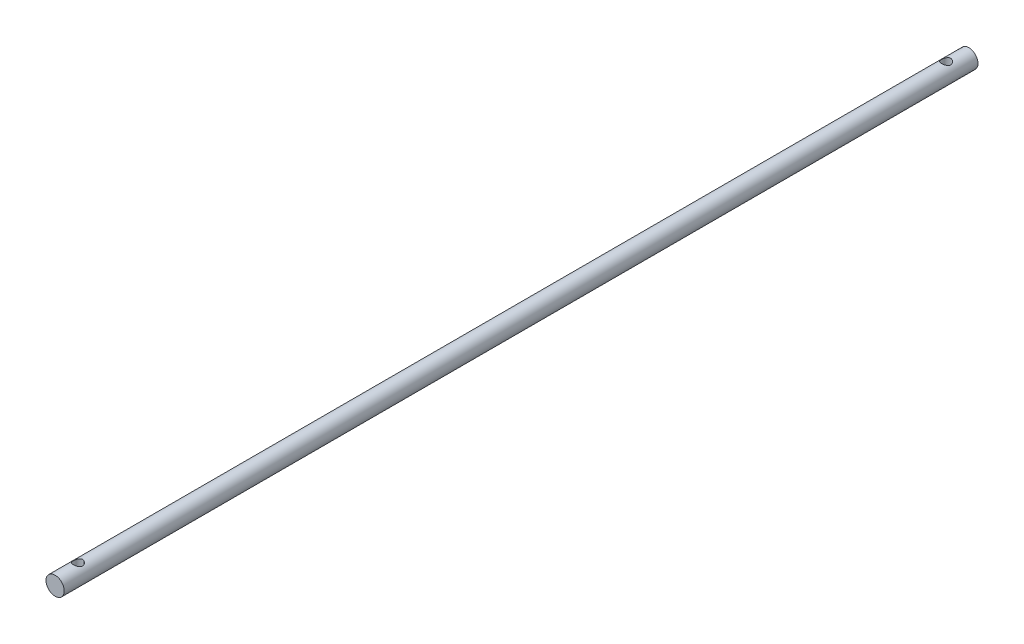
ISO-10303-21;
HEADER;
FILE_DESCRIPTION(('STEP AP214'),'2;1');
FILE_NAME('part.step','',(''),(''),'','','');
FILE_SCHEMA(('AUTOMOTIVE_DESIGN { 1 0 10303 214 1 1 1 1 }'));
ENDSEC;
DATA;
#1=APPLICATION_CONTEXT('core data for automotive mechanical design processes');
#2=APPLICATION_PROTOCOL_DEFINITION('international standard','automotive_design',2000,#1);
#3=PRODUCT_CONTEXT('',#1,'mechanical');
#4=PRODUCT('Part','Part','',(#3));
#5=PRODUCT_RELATED_PRODUCT_CATEGORY('part','',(#4));
#6=PRODUCT_DEFINITION_FORMATION('','',#4);
#7=PRODUCT_DEFINITION_CONTEXT('part definition',#1,'design');
#8=PRODUCT_DEFINITION('design','',#6,#7);
#9=PRODUCT_DEFINITION_SHAPE('','',#8);
#10=(LENGTH_UNIT() NAMED_UNIT(*) SI_UNIT(.MILLI.,.METRE.));
#11=(NAMED_UNIT(*) PLANE_ANGLE_UNIT() SI_UNIT($,.RADIAN.));
#12=(NAMED_UNIT(*) SI_UNIT($,.STERADIAN.) SOLID_ANGLE_UNIT());
#13=UNCERTAINTY_MEASURE_WITH_UNIT(LENGTH_MEASURE(1.E-05),#10,'distance_accuracy_value','');
#14=(GEOMETRIC_REPRESENTATION_CONTEXT(3) GLOBAL_UNCERTAINTY_ASSIGNED_CONTEXT((#13)) GLOBAL_UNIT_ASSIGNED_CONTEXT((#10,
#11,#12)) REPRESENTATION_CONTEXT('',''));
#15=CARTESIAN_POINT('',(0.,0.,0.));
#16=DIRECTION('',(0.,0.,1.));
#17=DIRECTION('',(1.,0.,0.));
#18=AXIS2_PLACEMENT_3D('',#15,#16,#17);
#19=CARTESIAN_POINT('',(0.,0.,400.));
#20=DIRECTION('',(0.,0.,-1.));
#21=DIRECTION('',(-1.,0.,0.));
#22=AXIS2_PLACEMENT_3D('',#19,#20,#21);
#23=CYLINDRICAL_SURFACE('',#22,4.);
#24=CARTESIAN_POINT('',(0.,4.,8.00000000000001));
#25=CARTESIAN_POINT('',(0.105143925902467,3.99999426810082,8.00000660463439));
#26=CARTESIAN_POINT('',(0.210413199395124,3.99580982039513,8.00834014624212));
#27=CARTESIAN_POINT('',(0.417840470537791,3.97948312074314,8.04130576068308));
#28=CARTESIAN_POINT('',(0.519992173427257,3.96732575657839,8.06596878599564));
#29=CARTESIAN_POINT('',(0.717867089760895,3.93632558806751,8.13038761723327));
#30=CARTESIAN_POINT('',(0.813613605878289,3.91750878355075,8.17008476849595));
#31=CARTESIAN_POINT('',(0.996945233613194,3.87491553031523,8.26314124272998));
#32=CARTESIAN_POINT('',(1.08453098798011,3.85113947267051,8.31649948849774));
#33=CARTESIAN_POINT('',(1.25501563552381,3.79912516516124,8.43903449897058));
#34=CARTESIAN_POINT('',(1.33731042224421,3.77070398255074,8.50897295847928));
#35=CARTESIAN_POINT('',(1.48955888973395,3.71319940493486,8.66104295849408));
#36=CARTESIAN_POINT('',(1.55950316621353,3.6841155241807,8.74318370354489));
#37=CARTESIAN_POINT('',(1.69050400090055,3.62597902394695,8.92496669904677));
#38=CARTESIAN_POINT('',(1.75045067110327,3.59710373940264,9.02547219669183));
#39=CARTESIAN_POINT('',(1.85233645378138,3.54571957544641,9.23673467197243));
#40=CARTESIAN_POINT('',(1.89428842993266,3.5232061521398,9.3474842574455));
#41=CARTESIAN_POINT('',(1.95626488437717,3.48915734075618,9.56933021084385));
#42=CARTESIAN_POINT('',(1.97745171416087,3.47704543167428,9.68000890413479));
#43=CARTESIAN_POINT('',(2.00085398661768,3.46363779897056,9.90395767555896));
#44=CARTESIAN_POINT('',(2.00308817674614,3.46233138686577,10.0172250817423));
#45=CARTESIAN_POINT('',(1.98937457434458,3.47021860514497,10.2285720486307));
#46=CARTESIAN_POINT('',(1.97556911907363,3.47817527324028,10.3268480624461));
#47=CARTESIAN_POINT('',(1.93387969811386,3.50152457467701,10.5194438187461));
#48=CARTESIAN_POINT('',(1.90599124779529,3.51691957663553,10.6137622906106));
#49=CARTESIAN_POINT('',(1.836419560772,3.55374952825483,10.7984582651313));
#50=CARTESIAN_POINT('',(1.79443013423198,3.57531681327997,10.8886927975716));
#51=CARTESIAN_POINT('',(1.698083375336,3.62206808562808,11.06126858518));
#52=CARTESIAN_POINT('',(1.64372048762493,3.64725369560382,11.1436062712002));
#53=CARTESIAN_POINT('',(1.51613210982557,3.70226315806572,11.3090425054864));
#54=CARTESIAN_POINT('',(1.44138891673856,3.73227020473493,11.3909137471523));
#55=CARTESIAN_POINT('',(1.27911115748274,3.79095246600815,11.5414708371818));
#56=CARTESIAN_POINT('',(1.19157051314856,3.81962703917602,11.6101503840678));
#57=CARTESIAN_POINT('',(1.00103301166369,3.87403974565928,11.7353713220594));
#58=CARTESIAN_POINT('',(0.897507183198813,3.89957968324015,11.7912009448915));
#59=CARTESIAN_POINT('',(0.68093243097759,3.94315762242485,11.884194058086));
#60=CARTESIAN_POINT('',(0.567891152530549,3.96120157887106,11.9213723700303));
#61=CARTESIAN_POINT('',(0.345532983321403,3.98648667482871,11.9729508074333));
#62=CARTESIAN_POINT('',(0.236683061096651,3.9944987660262,11.9889824714936));
#63=CARTESIAN_POINT('',(0.0175591998987025,4.00146026918207,12.002929462269));
#64=CARTESIAN_POINT('',(-0.092714039739818,4.00041397442637,12.0008533712789));
#65=CARTESIAN_POINT('',(-0.302465943971974,3.9898238450687,11.9795866231625));
#66=CARTESIAN_POINT('',(-0.40211881609986,3.98094491376337,11.96173493454));
#67=CARTESIAN_POINT('',(-0.596813784603881,3.95644342629681,11.9115238562097));
#68=CARTESIAN_POINT('',(-0.691855371382173,3.94082012668824,11.879162867093));
#69=CARTESIAN_POINT('',(-0.877777216899143,3.90368502827176,11.8000030671339));
#70=CARTESIAN_POINT('',(-0.968460794011604,3.88201763539262,11.7528178997674));
#71=CARTESIAN_POINT('',(-1.14092272339854,3.83487948634835,11.6457849287069));
#72=CARTESIAN_POINT('',(-1.22269725955318,3.80940711133877,11.5859317308092));
#73=CARTESIAN_POINT('',(-1.38353537857843,3.75416442672396,11.4484791493386));
#74=CARTESIAN_POINT('',(-1.46154415563805,3.72421769686999,11.3697142631097));
#75=CARTESIAN_POINT('',(-1.6037126422377,3.6652478321764,11.2001496974445));
#76=CARTESIAN_POINT('',(-1.66786277142374,3.63622534800094,11.1093417623042));
#77=CARTESIAN_POINT('',(-1.78341582895803,3.58102384412979,10.912712691654));
#78=CARTESIAN_POINT('',(-1.83405099160049,3.55505059178122,10.806377467811));
#79=CARTESIAN_POINT('',(-1.9161656518694,3.5114814458827,10.5849798648501));
#80=CARTESIAN_POINT('',(-1.94766983173402,3.493874764435,10.4699289470662));
#81=CARTESIAN_POINT('',(-1.98772337493374,3.47123002051604,10.2461795542306));
#82=CARTESIAN_POINT('',(-1.99818599281089,3.4651476693013,10.1379314931295));
#83=CARTESIAN_POINT('',(-2.0013783087524,3.46330709283207,9.92110586567095));
#84=CARTESIAN_POINT('',(-1.99411569324647,3.46754439252781,9.81252846252428));
#85=CARTESIAN_POINT('',(-1.96385225118661,3.48475724102154,9.60903299693313));
#86=CARTESIAN_POINT('',(-1.94241662868606,3.49686188965317,9.51379905971052));
#87=CARTESIAN_POINT('',(-1.88635071644881,3.52742032375306,9.32838376115127));
#88=CARTESIAN_POINT('',(-1.85171618231983,3.54587615139337,9.23820403581594));
#89=CARTESIAN_POINT('',(-1.76763149060112,3.58857060729072,9.05875029802693));
#90=CARTESIAN_POINT('',(-1.71734227563139,3.61311444791841,8.96994419634195));
#91=CARTESIAN_POINT('',(-1.60430194327478,3.66470663269721,8.80145092763749));
#92=CARTESIAN_POINT('',(-1.54154434248311,3.69175627591222,8.72176853895778));
#93=CARTESIAN_POINT('',(-1.39640665332274,3.74924646316185,8.56371603529066));
#94=CARTESIAN_POINT('',(-1.31256884599451,3.77969966613257,8.48668179529943));
#95=CARTESIAN_POINT('',(-1.13230961246639,3.83755504519862,8.34747403312947));
#96=CARTESIAN_POINT('',(-1.03588144661039,3.8649555725239,8.28530852106019));
#97=CARTESIAN_POINT('',(-0.831863193565884,3.91396019133075,8.17752727457587));
#98=CARTESIAN_POINT('',(-0.724199007553455,3.93552192987866,8.13203166152707));
#99=CARTESIAN_POINT('',(-0.501484202276167,3.97002682597974,8.06038366448519));
#100=CARTESIAN_POINT('',(-0.386455599178194,3.98299446726136,8.03417630638858));
#101=CARTESIAN_POINT('',(-0.225203892981785,3.99390923826956,8.01220517782853));
#102=CARTESIAN_POINT('',(-0.180323758883125,3.99618730680502,8.00763471826733));
#103=CARTESIAN_POINT('',(-0.0903034636101807,3.99923393953631,8.00153066897184));
#104=CARTESIAN_POINT('',(-0.0451632952932556,4.00000246206762,7.99999716305959));
#105=CARTESIAN_POINT('',(0.,4.,8.00000000000001));
#106=B_SPLINE_CURVE_WITH_KNOTS('',3,(#24,#25,#26,#27,#28,#29,#30,#31,#32,#33,#34,#35,#36,#37,
#38,#39,#40,#41,#42,#43,#44,#45,#46,#47,#48,#49,#50,#51,#52,#53,#54,#55,#56,#57,#58,#59,#60,#61,
#62,#63,#64,#65,#66,#67,#68,#69,#70,#71,#72,#73,#74,#75,#76,#77,#78,#79,#80,#81,#82,#83,#84,#85,
#86,#87,#88,#89,#90,#91,#92,#93,#94,#95,#96,#97,#98,#99,#100,#101,#102,#103,#104,#105),
.UNSPECIFIED.,.T.,.F.,(4,2,2,2,2,2,2,2,2,2,2,2,2,2,2,2,2,2,2,2,2,2,2,2,2,2,2,2,2,2,2,2,2,2,2,2,
2,2,2,2,4),(0.,0.315248514840584,0.631096299418393,0.945724310984593,1.26032752116313,
1.59396351743617,1.92785247530806,2.28763452861505,2.64715895796561,2.98516024280458,
3.32282714658039,3.6201142481864,3.91749607851355,4.22180480336973,4.52625042520442,
4.86929882667755,5.2125106919737,5.57166044428879,5.93052433824556,6.25966580942688,
6.58865129022949,6.89213813012241,7.1956584326186,7.50785712055794,7.82018901496675,
8.16319221288834,8.5064317723086,8.86629364323447,9.22569023890897,9.55058615006089,
9.87534119729352,10.1691586049771,10.463070575767,10.7767291356057,11.0905512228726,
11.4425048551434,11.7946476676249,12.1492802732705,12.5028981724229,12.6383056026783,
12.7737167702213),.UNSPECIFIED.);
#107=CARTESIAN_POINT('',(0.,4.,8.00000000000001));
#108=VERTEX_POINT('',#107);
#109=EDGE_CURVE('E10',#108,#108,#106,.T.);
#110=ORIENTED_EDGE('',*,*,#109,.T.);
#111=EDGE_LOOP('',(#110));
#112=FACE_BOUND('',#111,.T.);
#113=CARTESIAN_POINT('',(0.,4.,388.));
#114=CARTESIAN_POINT('',(0.105143925902465,3.99999426810082,388.000006604634));
#115=CARTESIAN_POINT('',(0.21041319939512,3.99580982039513,388.008340146242));
#116=CARTESIAN_POINT('',(0.417840470537787,3.97948312074314,388.041305760683));
#117=CARTESIAN_POINT('',(0.519992173427257,3.96732575657839,388.065968785996));
#118=CARTESIAN_POINT('',(0.71786708976089,3.93632558806751,388.130387617233));
#119=CARTESIAN_POINT('',(0.813613605878276,3.91750878355075,388.170084768496));
#120=CARTESIAN_POINT('',(0.996945233613181,3.87491553031523,388.26314124273));
#121=CARTESIAN_POINT('',(1.08453098798011,3.85113947267051,388.316499488498));
#122=CARTESIAN_POINT('',(1.2550156355238,3.79912516516124,388.439034498971));
#123=CARTESIAN_POINT('',(1.33731042224419,3.77070398255076,388.508972958479));
#124=CARTESIAN_POINT('',(1.48955888973393,3.71319940493487,388.661042958494));
#125=CARTESIAN_POINT('',(1.55950316621352,3.6841155241807,388.743183703545));
#126=CARTESIAN_POINT('',(1.69050400090055,3.62597902394695,388.924966699047));
#127=CARTESIAN_POINT('',(1.75045067110326,3.59710373940265,389.025472196692));
#128=CARTESIAN_POINT('',(1.85233645378137,3.54571957544642,389.236734671972));
#129=CARTESIAN_POINT('',(1.89428842993264,3.5232061521398,389.347484257446));
#130=CARTESIAN_POINT('',(1.95626488437715,3.48915734075618,389.569330210844));
#131=CARTESIAN_POINT('',(1.97745171416086,3.47704543167428,389.680008904135));
#132=CARTESIAN_POINT('',(2.00085398661768,3.46363779897056,389.903957675559));
#133=CARTESIAN_POINT('',(2.00308817674614,3.46233138686576,390.017225081742));
#134=CARTESIAN_POINT('',(1.98937457434458,3.47021860514497,390.228572048631));
#135=CARTESIAN_POINT('',(1.97556911907364,3.47817527324027,390.326848062446));
#136=CARTESIAN_POINT('',(1.93387969811387,3.501524574677,390.519443818746));
#137=CARTESIAN_POINT('',(1.9059912477953,3.51691957663553,390.613762290611));
#138=CARTESIAN_POINT('',(1.836419560772,3.55374952825482,390.798458265131));
#139=CARTESIAN_POINT('',(1.79443013423199,3.57531681327997,390.888692797572));
#140=CARTESIAN_POINT('',(1.69808337533601,3.62206808562807,391.06126858518));
#141=CARTESIAN_POINT('',(1.64372048762494,3.64725369560381,391.1436062712));
#142=CARTESIAN_POINT('',(1.51613210982559,3.70226315806571,391.309042505487));
#143=CARTESIAN_POINT('',(1.44138891673858,3.73227020473492,391.390913747152));
#144=CARTESIAN_POINT('',(1.27911115748277,3.79095246600814,391.541470837182));
#145=CARTESIAN_POINT('',(1.1915705131486,3.81962703917601,391.610150384068));
#146=CARTESIAN_POINT('',(1.00103301166373,3.87403974565927,391.735371322059));
#147=CARTESIAN_POINT('',(0.897507183198855,3.89957968324014,391.791200944891));
#148=CARTESIAN_POINT('',(0.680932430977628,3.94315762242484,391.884194058086));
#149=CARTESIAN_POINT('',(0.567891152530584,3.96120157887106,391.92137237003));
#150=CARTESIAN_POINT('',(0.34553298332143,3.98648667482871,391.972950807433));
#151=CARTESIAN_POINT('',(0.236683061096674,3.9944987660262,391.988982471494));
#152=CARTESIAN_POINT('',(0.0175591998987177,4.00146026918207,392.002929462269));
#153=CARTESIAN_POINT('',(-0.0927140397398067,4.00041397442638,392.000853371279));
#154=CARTESIAN_POINT('',(-0.302465943971963,3.9898238450687,391.979586623163));
#155=CARTESIAN_POINT('',(-0.402118816099846,3.98094491376337,391.96173493454));
#156=CARTESIAN_POINT('',(-0.596813784603866,3.95644342629681,391.91152385621));
#157=CARTESIAN_POINT('',(-0.691855371382159,3.94082012668824,391.879162867093));
#158=CARTESIAN_POINT('',(-0.877777216899126,3.90368502827176,391.800003067134));
#159=CARTESIAN_POINT('',(-0.968460794011582,3.88201763539262,391.752817899767));
#160=CARTESIAN_POINT('',(-1.14092272339853,3.83487948634836,391.645784928707));
#161=CARTESIAN_POINT('',(-1.22269725955318,3.80940711133877,391.585931730809));
#162=CARTESIAN_POINT('',(-1.38353537857844,3.75416442672396,391.448479149339));
#163=CARTESIAN_POINT('',(-1.46154415563806,3.72421769686998,391.36971426311));
#164=CARTESIAN_POINT('',(-1.60371264223771,3.6652478321764,391.200149697445));
#165=CARTESIAN_POINT('',(-1.66786277142375,3.63622534800094,391.109341762304));
#166=CARTESIAN_POINT('',(-1.78341582895804,3.58102384412978,390.912712691654));
#167=CARTESIAN_POINT('',(-1.83405099160049,3.55505059178122,390.806377467811));
#168=CARTESIAN_POINT('',(-1.9161656518694,3.5114814458827,390.58497986485));
#169=CARTESIAN_POINT('',(-1.94766983173402,3.493874764435,390.469928947066));
#170=CARTESIAN_POINT('',(-1.98772337493373,3.47123002051605,390.246179554231));
#171=CARTESIAN_POINT('',(-1.99818599281089,3.46514766930131,390.13793149313));
#172=CARTESIAN_POINT('',(-2.0013783087524,3.46330709283207,389.921105865671));
#173=CARTESIAN_POINT('',(-1.99411569324648,3.4675443925278,389.812528462524));
#174=CARTESIAN_POINT('',(-1.96385225118662,3.48475724102153,389.609032996933));
#175=CARTESIAN_POINT('',(-1.94241662868606,3.49686188965317,389.513799059711));
#176=CARTESIAN_POINT('',(-1.88635071644881,3.52742032375306,389.328383761151));
#177=CARTESIAN_POINT('',(-1.85171618231983,3.54587615139337,389.238204035816));
#178=CARTESIAN_POINT('',(-1.76763149060112,3.58857060729072,389.058750298027));
#179=CARTESIAN_POINT('',(-1.71734227563141,3.61311444791841,388.969944196342));
#180=CARTESIAN_POINT('',(-1.6043019432748,3.6647066326972,388.801450927638));
#181=CARTESIAN_POINT('',(-1.54154434248314,3.69175627591221,388.721768538958));
#182=CARTESIAN_POINT('',(-1.39640665332276,3.74924646316184,388.563716035291));
#183=CARTESIAN_POINT('',(-1.31256884599454,3.77969966613256,388.486681795299));
#184=CARTESIAN_POINT('',(-1.13230961246641,3.83755504519861,388.347474033129));
#185=CARTESIAN_POINT('',(-1.03588144661041,3.8649555725239,388.28530852106));
#186=CARTESIAN_POINT('',(-0.8318631935659,3.91396019133074,388.177527274576));
#187=CARTESIAN_POINT('',(-0.72419900755347,3.93552192987866,388.132031661527));
#188=CARTESIAN_POINT('',(-0.501484202276176,3.97002682597974,388.060383664485));
#189=CARTESIAN_POINT('',(-0.386455599178196,3.98299446726136,388.034176306389));
#190=CARTESIAN_POINT('',(-0.22520389298178,3.99390923826956,388.012205177829));
#191=CARTESIAN_POINT('',(-0.180323758883121,3.99618730680502,388.007634718267));
#192=CARTESIAN_POINT('',(-0.0903034636101788,3.99923393953631,388.001530668972));
#193=CARTESIAN_POINT('',(-0.0451632952932545,4.00000246206762,387.99999716306));
#194=CARTESIAN_POINT('',(0.,4.,388.));
#195=B_SPLINE_CURVE_WITH_KNOTS('',3,(#113,#114,#115,#116,#117,#118,#119,#120,#121,#122,#123,
#124,#125,#126,#127,#128,#129,#130,#131,#132,#133,#134,#135,#136,#137,#138,#139,#140,#141,#142,
#143,#144,#145,#146,#147,#148,#149,#150,#151,#152,#153,#154,#155,#156,#157,#158,#159,#160,#161,
#162,#163,#164,#165,#166,#167,#168,#169,#170,#171,#172,#173,#174,#175,#176,#177,#178,#179,#180,
#181,#182,#183,#184,#185,#186,#187,#188,#189,#190,#191,#192,#193,#194),.UNSPECIFIED.,.T.,.F.,(4,
2,2,2,2,2,2,2,2,2,2,2,2,2,2,2,2,2,2,2,2,2,2,2,2,2,2,2,2,2,2,2,2,2,2,2,2,2,2,2,4),(0.,
0.315248514840585,0.631096299418379,0.94572431098458,1.26032752116313,1.59396351743613,
1.92785247530804,2.287634528615,2.64715895796558,2.98516024280451,3.32282714658039,
3.62011424818633,3.91749607851353,4.22180480336971,4.52625042520441,4.86929882667752,
5.21251069197366,5.57166044428874,5.93052433824553,6.25966580942686,6.58865129022948,
6.89213813012238,7.1956584326186,7.50785712055793,7.82018901496675,8.16319221288838,
8.50643177230861,8.86629364323449,9.22569023890897,9.55058615006082,9.87534119729351,
10.1691586049771,10.463070575767,10.7767291356057,11.0905512228726,11.4425048551434,
11.7946476676248,12.1492802732705,12.5028981724229,12.6383056026783,12.7737167702213),.UNSPECIFIED.);
#196=CARTESIAN_POINT('',(0.,4.,388.));
#197=VERTEX_POINT('',#196);
#198=EDGE_CURVE('E41',#197,#197,#195,.T.);
#199=ORIENTED_EDGE('',*,*,#198,.T.);
#200=EDGE_LOOP('',(#199));
#201=FACE_BOUND('',#200,.T.);
#202=CARTESIAN_POINT('',(0.,0.,400.));
#203=DIRECTION('',(0.,0.,1.));
#204=DIRECTION('',(1.,0.,0.));
#205=AXIS2_PLACEMENT_3D('',#202,#203,#204);
#206=CIRCLE('',#205,4.);
#207=CARTESIAN_POINT('',(4.,0.,400.));
#208=VERTEX_POINT('',#207);
#209=EDGE_CURVE('E45',#208,#208,#206,.T.);
#210=ORIENTED_EDGE('',*,*,#209,.F.);
#211=EDGE_LOOP('',(#210));
#212=FACE_BOUND('',#211,.T.);
#213=CARTESIAN_POINT('',(0.,0.,0.));
#214=DIRECTION('',(0.,0.,1.));
#215=DIRECTION('',(1.,0.,0.));
#216=AXIS2_PLACEMENT_3D('',#213,#214,#215);
#217=CIRCLE('',#216,4.);
#218=CARTESIAN_POINT('',(4.,0.,0.));
#219=VERTEX_POINT('',#218);
#220=EDGE_CURVE('E49',#219,#219,#217,.T.);
#221=ORIENTED_EDGE('',*,*,#220,.T.);
#222=EDGE_LOOP('',(#221));
#223=FACE_BOUND('',#222,.T.);
#224=ADVANCED_FACE('F31',(#112,#201,#212,#223),#23,.T.);
#225=CARTESIAN_POINT('',(0.,0.,400.));
#226=DIRECTION('',(0.,0.,1.));
#227=DIRECTION('',(1.,0.,0.));
#228=AXIS2_PLACEMENT_3D('',#225,#226,#227);
#229=PLANE('',#228);
#230=ORIENTED_EDGE('',*,*,#209,.T.);
#231=EDGE_LOOP('',(#230));
#232=FACE_BOUND('',#231,.T.);
#233=ADVANCED_FACE('F68',(#232),#229,.T.);
#234=CARTESIAN_POINT('',(0.,0.,0.));
#235=DIRECTION('',(0.,0.,1.));
#236=DIRECTION('',(1.,0.,0.));
#237=AXIS2_PLACEMENT_3D('',#234,#235,#236);
#238=PLANE('',#237);
#239=ORIENTED_EDGE('',*,*,#220,.F.);
#240=EDGE_LOOP('',(#239));
#241=FACE_BOUND('',#240,.T.);
#242=ADVANCED_FACE('F61',(#241),#238,.F.);
#243=CARTESIAN_POINT('',(0.,0.,390.));
#244=DIRECTION('',(0.,-1.,0.));
#245=DIRECTION('',(0.,0.,-1.));
#246=AXIS2_PLACEMENT_3D('',#243,#244,#245);
#247=CYLINDRICAL_SURFACE('',#246,1.99999999999999);
#248=CARTESIAN_POINT('',(0.,0.,390.));
#249=DIRECTION('',(0.,-1.,0.));
#250=DIRECTION('',(0.,0.,-1.));
#251=AXIS2_PLACEMENT_3D('',#248,#249,#250);
#252=CIRCLE('',#251,1.99999999999999);
#253=CARTESIAN_POINT('',(0.,0.,388.));
#254=VERTEX_POINT('',#253);
#255=EDGE_CURVE('E83',#254,#254,#252,.T.);
#256=ORIENTED_EDGE('',*,*,#255,.T.);
#257=EDGE_LOOP('',(#256));
#258=FACE_BOUND('',#257,.T.);
#259=ORIENTED_EDGE('',*,*,#198,.F.);
#260=EDGE_LOOP('',(#259));
#261=FACE_BOUND('',#260,.T.);
#262=ADVANCED_FACE('F55',(#258,#261),#247,.F.);
#263=CARTESIAN_POINT('',(1.99999999999999,0.,390.));
#264=DIRECTION('',(0.,-1.,0.));
#265=DIRECTION('',(0.,0.,-1.));
#266=AXIS2_PLACEMENT_3D('',#263,#264,#265);
#267=PLANE('',#266);
#268=ORIENTED_EDGE('',*,*,#255,.F.);
#269=EDGE_LOOP('',(#268));
#270=FACE_BOUND('',#269,.T.);
#271=ADVANCED_FACE('F60',(#270),#267,.F.);
#272=CARTESIAN_POINT('',(0.,0.,10.));
#273=DIRECTION('',(0.,-1.,0.));
#274=DIRECTION('',(0.,0.,-1.));
#275=AXIS2_PLACEMENT_3D('',#272,#273,#274);
#276=CYLINDRICAL_SURFACE('',#275,1.99999999999999);
#277=CARTESIAN_POINT('',(0.,0.,10.));
#278=DIRECTION('',(0.,-1.,0.));
#279=DIRECTION('',(0.,0.,-1.));
#280=AXIS2_PLACEMENT_3D('',#277,#278,#279);
#281=CIRCLE('',#280,1.99999999999999);
#282=CARTESIAN_POINT('',(0.,0.,8.00000000000001));
#283=VERTEX_POINT('',#282);
#284=EDGE_CURVE('E85',#283,#283,#281,.T.);
#285=ORIENTED_EDGE('',*,*,#284,.T.);
#286=EDGE_LOOP('',(#285));
#287=FACE_BOUND('',#286,.T.);
#288=ORIENTED_EDGE('',*,*,#109,.F.);
#289=EDGE_LOOP('',(#288));
#290=FACE_BOUND('',#289,.T.);
#291=ADVANCED_FACE('F66',(#287,#290),#276,.F.);
#292=CARTESIAN_POINT('',(1.99999999999999,0.,10.));
#293=DIRECTION('',(0.,-1.,0.));
#294=DIRECTION('',(0.,0.,-1.));
#295=AXIS2_PLACEMENT_3D('',#292,#293,#294);
#296=PLANE('',#295);
#297=ORIENTED_EDGE('',*,*,#284,.F.);
#298=EDGE_LOOP('',(#297));
#299=FACE_BOUND('',#298,.T.);
#300=ADVANCED_FACE('F63',(#299),#296,.F.);
#301=CLOSED_SHELL('',(#224,#233,#242,#262,#271,#291,#300));
#302=MANIFOLD_SOLID_BREP('B2',#301);
#303=ADVANCED_BREP_SHAPE_REPRESENTATION('',(#18,#302),#14);
#304=SHAPE_DEFINITION_REPRESENTATION(#9,#303);
ENDSEC;
END-ISO-10303-21;
